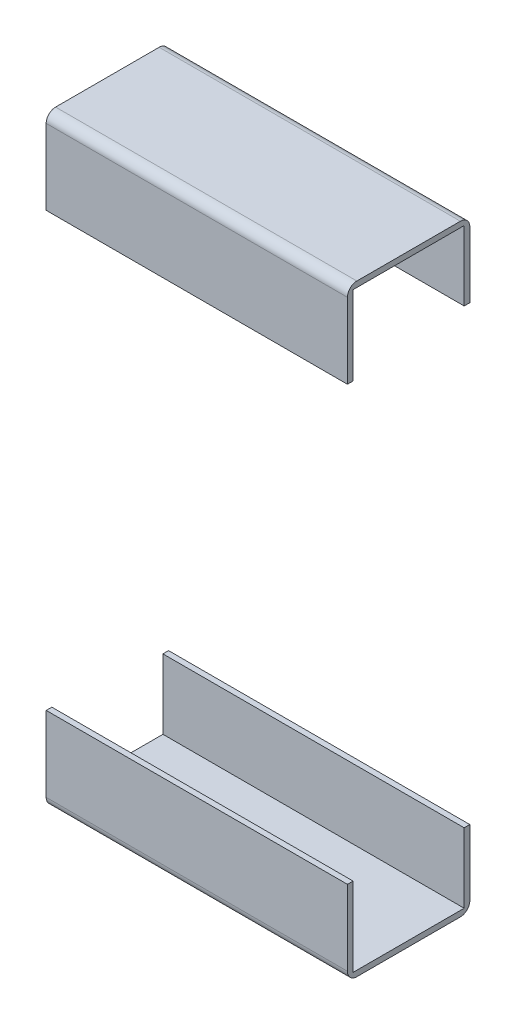
ISO-10303-21;
HEADER;
FILE_DESCRIPTION(('STEP AP214'),'2;1');
FILE_NAME('part.step','',(''),(''),'','','');
FILE_SCHEMA(('AUTOMOTIVE_DESIGN { 1 0 10303 214 1 1 1 1 }'));
ENDSEC;
DATA;
#1=APPLICATION_CONTEXT('core data for automotive mechanical design processes');
#2=APPLICATION_PROTOCOL_DEFINITION('international standard','automotive_design',2000,#1);
#3=PRODUCT_CONTEXT('',#1,'mechanical');
#4=PRODUCT('Part','Part','',(#3));
#5=PRODUCT_RELATED_PRODUCT_CATEGORY('part','',(#4));
#6=PRODUCT_DEFINITION_FORMATION('','',#4);
#7=PRODUCT_DEFINITION_CONTEXT('part definition',#1,'design');
#8=PRODUCT_DEFINITION('design','',#6,#7);
#9=PRODUCT_DEFINITION_SHAPE('','',#8);
#10=(LENGTH_UNIT() NAMED_UNIT(*) SI_UNIT(.MILLI.,.METRE.));
#11=(NAMED_UNIT(*) PLANE_ANGLE_UNIT() SI_UNIT($,.RADIAN.));
#12=(NAMED_UNIT(*) SI_UNIT($,.STERADIAN.) SOLID_ANGLE_UNIT());
#13=UNCERTAINTY_MEASURE_WITH_UNIT(LENGTH_MEASURE(1.E-05),#10,'distance_accuracy_value','');
#14=(GEOMETRIC_REPRESENTATION_CONTEXT(3) GLOBAL_UNCERTAINTY_ASSIGNED_CONTEXT((#13)) GLOBAL_UNIT_ASSIGNED_CONTEXT((#10,
#11,#12)) REPRESENTATION_CONTEXT('',''));
#15=CARTESIAN_POINT('',(0.,0.,0.));
#16=DIRECTION('',(0.,0.,1.));
#17=DIRECTION('',(1.,0.,0.));
#18=AXIS2_PLACEMENT_3D('',#15,#16,#17);
#19=CARTESIAN_POINT('',(0.8,1.375,0.325));
#20=DIRECTION('',(1.,0.,0.));
#21=DIRECTION('',(0.,1.,0.));
#22=AXIS2_PLACEMENT_3D('',#19,#20,#21);
#23=PLANE('',#22);
#24=CARTESIAN_POINT('',(0.8,1.55,0.05));
#25=DIRECTION('',(-1.,0.,0.));
#26=DIRECTION('',(0.,0.707106781186548,-0.707106781186548));
#27=AXIS2_PLACEMENT_3D('',#24,#25,#26);
#28=CIRCLE('',#27,0.05);
#29=CARTESIAN_POINT('',(0.8,1.6,0.05));
#30=VERTEX_POINT('',#29);
#31=CARTESIAN_POINT('',(0.8,1.55,0.));
#32=VERTEX_POINT('',#31);
#33=EDGE_CURVE('P0_E124',#30,#32,#28,.T.);
#34=ORIENTED_EDGE('',*,*,#33,.F.);
#35=DIRECTION('',(0.,0.,1.));
#36=VECTOR('',#35,1.);
#37=CARTESIAN_POINT('',(0.8,1.6,0.));
#38=LINE('',#37,#36);
#39=CARTESIAN_POINT('',(0.8,1.6,0.6));
#40=VERTEX_POINT('',#39);
#41=EDGE_CURVE('P0_E185',#30,#40,#38,.T.);
#42=ORIENTED_EDGE('',*,*,#41,.T.);
#43=CARTESIAN_POINT('',(0.8,1.55,0.6));
#44=DIRECTION('',(-1.,0.,0.));
#45=DIRECTION('',(0.,0.707106781186548,0.707106781186548));
#46=AXIS2_PLACEMENT_3D('',#43,#44,#45);
#47=CIRCLE('',#46,0.05);
#48=CARTESIAN_POINT('',(0.8,1.55,0.65));
#49=VERTEX_POINT('',#48);
#50=EDGE_CURVE('P0_E167',#49,#40,#47,.T.);
#51=ORIENTED_EDGE('',*,*,#50,.F.);
#52=DIRECTION('',(0.,-1.,0.));
#53=VECTOR('',#52,1.);
#54=CARTESIAN_POINT('',(0.8,1.6,0.65));
#55=LINE('',#54,#53);
#56=CARTESIAN_POINT('',(0.8,1.15,0.65));
#57=VERTEX_POINT('',#56);
#58=EDGE_CURVE('P0_E132',#49,#57,#55,.T.);
#59=ORIENTED_EDGE('',*,*,#58,.T.);
#60=DIRECTION('',(0.,0.,-1.));
#61=VECTOR('',#60,1.);
#62=CARTESIAN_POINT('',(0.8,1.15,0.65));
#63=LINE('',#62,#61);
#64=CARTESIAN_POINT('',(0.8,1.15,0.62));
#65=VERTEX_POINT('',#64);
#66=EDGE_CURVE('P0_E11',#57,#65,#63,.T.);
#67=ORIENTED_EDGE('',*,*,#66,.T.);
#68=DIRECTION('',(0.,1.,6.3751913796E-11));
#69=VECTOR('',#68,1.);
#70=CARTESIAN_POINT('',(0.8,1.15,0.62));
#71=LINE('',#70,#69);
#72=CARTESIAN_POINT('',(0.8,1.570000000033,0.620000000027));
#73=VERTEX_POINT('',#72);
#74=EDGE_CURVE('P0_E161',#65,#73,#71,.T.);
#75=ORIENTED_EDGE('',*,*,#74,.T.);
#76=DIRECTION('',(0.,0.,-1.));
#77=VECTOR('',#76,1.);
#78=CARTESIAN_POINT('',(0.8,1.570000000033,0.620000000027));
#79=LINE('',#78,#77);
#80=CARTESIAN_POINT('',(0.8,1.570000000033,0.02999999998487));
#81=VERTEX_POINT('',#80);
#82=EDGE_CURVE('P0_E201',#73,#81,#79,.T.);
#83=ORIENTED_EDGE('',*,*,#82,.T.);
#84=DIRECTION('',(0.,-1.,4.090209542698E-11));
#85=VECTOR('',#84,1.);
#86=CARTESIAN_POINT('',(0.8,1.570000000033,0.02999999998487));
#87=LINE('',#86,#85);
#88=CARTESIAN_POINT('',(0.8,1.2,0.03));
#89=VERTEX_POINT('',#88);
#90=EDGE_CURVE('P0_E193',#81,#89,#87,.T.);
#91=ORIENTED_EDGE('',*,*,#90,.T.);
#92=DIRECTION('',(0.,0.,-1.));
#93=VECTOR('',#92,1.);
#94=CARTESIAN_POINT('',(0.8,1.2,0.03));
#95=LINE('',#94,#93);
#96=CARTESIAN_POINT('',(0.8,1.2,0.));
#97=VERTEX_POINT('',#96);
#98=EDGE_CURVE('P0_E127',#89,#97,#95,.T.);
#99=ORIENTED_EDGE('',*,*,#98,.T.);
#100=DIRECTION('',(0.,1.,0.));
#101=VECTOR('',#100,1.);
#102=CARTESIAN_POINT('',(0.8,1.2,0.));
#103=LINE('',#102,#101);
#104=EDGE_CURVE('P0_E120',#97,#32,#103,.T.);
#105=ORIENTED_EDGE('',*,*,#104,.T.);
#106=EDGE_LOOP('',(#34,#42,#51,#59,#67,#75,#83,#91,#99,#105));
#107=FACE_BOUND('',#106,.T.);
#108=ADVANCED_FACE('P0_F16',(#107),#23,.T.);
#109=CARTESIAN_POINT('',(0.,1.15,0.65));
#110=DIRECTION('',(0.,-1.,0.));
#111=DIRECTION('',(0.,0.,-1.));
#112=AXIS2_PLACEMENT_3D('',#109,#110,#111);
#113=PLANE('',#112);
#114=DIRECTION('',(1.,0.,0.));
#115=VECTOR('',#114,1.);
#116=CARTESIAN_POINT('',(0.,1.15,0.62));
#117=LINE('',#116,#115);
#118=CARTESIAN_POINT('',(-0.8,1.15,0.62));
#119=VERTEX_POINT('',#118);
#120=EDGE_CURVE('P0_E27',#119,#65,#117,.T.);
#121=ORIENTED_EDGE('',*,*,#120,.T.);
#122=ORIENTED_EDGE('',*,*,#66,.F.);
#123=DIRECTION('',(1.,0.,0.));
#124=VECTOR('',#123,1.);
#125=CARTESIAN_POINT('',(0.,1.15,0.65));
#126=LINE('',#125,#124);
#127=CARTESIAN_POINT('',(-0.8,1.15,0.65));
#128=VERTEX_POINT('',#127);
#129=EDGE_CURVE('P0_E166',#128,#57,#126,.T.);
#130=ORIENTED_EDGE('',*,*,#129,.F.);
#131=DIRECTION('',(0.,0.,1.));
#132=VECTOR('',#131,1.);
#133=CARTESIAN_POINT('',(-0.8,1.15,0.65));
#134=LINE('',#133,#132);
#135=EDGE_CURVE('P0_E168',#119,#128,#134,.T.);
#136=ORIENTED_EDGE('',*,*,#135,.F.);
#137=EDGE_LOOP('',(#121,#122,#130,#136));
#138=FACE_BOUND('',#137,.T.);
#139=ADVANCED_FACE('P0_F243',(#138),#113,.T.);
#140=CARTESIAN_POINT('',(0.,1.15,0.62));
#141=DIRECTION('',(0.,6.3751913796E-11,-1.));
#142=DIRECTION('',(-1.,0.,0.));
#143=AXIS2_PLACEMENT_3D('',#140,#141,#142);
#144=PLANE('',#143);
#145=DIRECTION('',(1.,0.,0.));
#146=VECTOR('',#145,1.);
#147=CARTESIAN_POINT('',(0.,1.570000000033,0.620000000027));
#148=LINE('',#147,#146);
#149=CARTESIAN_POINT('',(-0.8,1.570000000033,0.620000000027));
#150=VERTEX_POINT('',#149);
#151=EDGE_CURVE('P0_E20',#150,#73,#148,.T.);
#152=ORIENTED_EDGE('',*,*,#151,.T.);
#153=ORIENTED_EDGE('',*,*,#74,.F.);
#154=ORIENTED_EDGE('',*,*,#120,.F.);
#155=DIRECTION('',(0.,-1.,-6.3751913796E-11));
#156=VECTOR('',#155,1.);
#157=CARTESIAN_POINT('',(-0.8,1.15,0.62));
#158=LINE('',#157,#156);
#159=EDGE_CURVE('P0_E158',#150,#119,#158,.T.);
#160=ORIENTED_EDGE('',*,*,#159,.F.);
#161=EDGE_LOOP('',(#152,#153,#154,#160));
#162=FACE_BOUND('',#161,.T.);
#163=ADVANCED_FACE('P0_F249',(#162),#144,.T.);
#164=CARTESIAN_POINT('',(0.,1.570000000033,0.620000000027));
#165=DIRECTION('',(0.,-1.,0.));
#166=DIRECTION('',(0.,0.,-1.));
#167=AXIS2_PLACEMENT_3D('',#164,#165,#166);
#168=PLANE('',#167);
#169=DIRECTION('',(1.,0.,0.));
#170=VECTOR('',#169,1.);
#171=CARTESIAN_POINT('',(0.,1.570000000033,0.02999999998487));
#172=LINE('',#171,#170);
#173=CARTESIAN_POINT('',(-0.8,1.570000000033,0.02999999998487));
#174=VERTEX_POINT('',#173);
#175=EDGE_CURVE('P0_E195',#174,#81,#172,.T.);
#176=ORIENTED_EDGE('',*,*,#175,.T.);
#177=ORIENTED_EDGE('',*,*,#82,.F.);
#178=ORIENTED_EDGE('',*,*,#151,.F.);
#179=DIRECTION('',(0.,0.,1.));
#180=VECTOR('',#179,1.);
#181=CARTESIAN_POINT('',(-0.8,1.570000000033,0.620000000027));
#182=LINE('',#181,#180);
#183=EDGE_CURVE('P0_E180',#174,#150,#182,.T.);
#184=ORIENTED_EDGE('',*,*,#183,.F.);
#185=EDGE_LOOP('',(#176,#177,#178,#184));
#186=FACE_BOUND('',#185,.T.);
#187=ADVANCED_FACE('P0_F254',(#186),#168,.T.);
#188=CARTESIAN_POINT('',(0.,1.570000000033,0.02999999998487));
#189=DIRECTION('',(0.,4.090209542698E-11,1.));
#190=DIRECTION('',(0.,-1.,4.090209542698E-11));
#191=AXIS2_PLACEMENT_3D('',#188,#189,#190);
#192=PLANE('',#191);
#193=DIRECTION('',(1.,0.,0.));
#194=VECTOR('',#193,1.);
#195=CARTESIAN_POINT('',(0.,1.2,0.03));
#196=LINE('',#195,#194);
#197=CARTESIAN_POINT('',(-0.8,1.2,0.03));
#198=VERTEX_POINT('',#197);
#199=EDGE_CURVE('P0_E196',#198,#89,#196,.T.);
#200=ORIENTED_EDGE('',*,*,#199,.T.);
#201=ORIENTED_EDGE('',*,*,#90,.F.);
#202=ORIENTED_EDGE('',*,*,#175,.F.);
#203=DIRECTION('',(0.,1.,-4.090209542698E-11));
#204=VECTOR('',#203,1.);
#205=CARTESIAN_POINT('',(-0.8,1.570000000033,0.02999999998487));
#206=LINE('',#205,#204);
#207=EDGE_CURVE('P0_E178',#198,#174,#206,.T.);
#208=ORIENTED_EDGE('',*,*,#207,.F.);
#209=EDGE_LOOP('',(#200,#201,#202,#208));
#210=FACE_BOUND('',#209,.T.);
#211=ADVANCED_FACE('P0_F18',(#210),#192,.T.);
#212=CARTESIAN_POINT('',(0.,1.2,0.03));
#213=DIRECTION('',(0.,-1.,0.));
#214=DIRECTION('',(0.,0.,-1.));
#215=AXIS2_PLACEMENT_3D('',#212,#213,#214);
#216=PLANE('',#215);
#217=DIRECTION('',(1.,0.,0.));
#218=VECTOR('',#217,1.);
#219=CARTESIAN_POINT('',(0.,1.2,0.));
#220=LINE('',#219,#218);
#221=CARTESIAN_POINT('',(-0.8,1.2,0.));
#222=VERTEX_POINT('',#221);
#223=EDGE_CURVE('P0_E131',#222,#97,#220,.T.);
#224=ORIENTED_EDGE('',*,*,#223,.T.);
#225=ORIENTED_EDGE('',*,*,#98,.F.);
#226=ORIENTED_EDGE('',*,*,#199,.F.);
#227=DIRECTION('',(0.,0.,1.));
#228=VECTOR('',#227,1.);
#229=CARTESIAN_POINT('',(-0.8,1.2,0.03));
#230=LINE('',#229,#228);
#231=EDGE_CURVE('P0_E175',#222,#198,#230,.T.);
#232=ORIENTED_EDGE('',*,*,#231,.F.);
#233=EDGE_LOOP('',(#224,#225,#226,#232));
#234=FACE_BOUND('',#233,.T.);
#235=ADVANCED_FACE('P0_F259',(#234),#216,.T.);
#236=CARTESIAN_POINT('',(0.,1.2,0.));
#237=DIRECTION('',(0.,0.,-1.));
#238=DIRECTION('',(0.,-1.,0.));
#239=AXIS2_PLACEMENT_3D('',#236,#237,#238);
#240=PLANE('',#239);
#241=DIRECTION('',(-1.,0.,0.));
#242=VECTOR('',#241,1.);
#243=CARTESIAN_POINT('',(0.,1.55,0.));
#244=LINE('',#243,#242);
#245=CARTESIAN_POINT('',(-0.8,1.55,0.));
#246=VERTEX_POINT('',#245);
#247=EDGE_CURVE('P0_E135',#32,#246,#244,.T.);
#248=ORIENTED_EDGE('',*,*,#247,.F.);
#249=ORIENTED_EDGE('',*,*,#104,.F.);
#250=ORIENTED_EDGE('',*,*,#223,.F.);
#251=DIRECTION('',(0.,-1.,0.));
#252=VECTOR('',#251,1.);
#253=CARTESIAN_POINT('',(-0.8,1.2,0.));
#254=LINE('',#253,#252);
#255=EDGE_CURVE('P0_E138',#246,#222,#254,.T.);
#256=ORIENTED_EDGE('',*,*,#255,.F.);
#257=EDGE_LOOP('',(#248,#249,#250,#256));
#258=FACE_BOUND('',#257,.T.);
#259=ADVANCED_FACE('P0_F136',(#258),#240,.T.);
#260=CARTESIAN_POINT('',(0.,1.6,0.65));
#261=DIRECTION('',(0.,0.,1.));
#262=DIRECTION('',(1.,0.,0.));
#263=AXIS2_PLACEMENT_3D('',#260,#261,#262);
#264=PLANE('',#263);
#265=DIRECTION('',(1.,0.,0.));
#266=VECTOR('',#265,1.);
#267=CARTESIAN_POINT('',(0.,1.55,0.65));
#268=LINE('',#267,#266);
#269=CARTESIAN_POINT('',(-0.8,1.55,0.65));
#270=VERTEX_POINT('',#269);
#271=EDGE_CURVE('P0_E162',#270,#49,#268,.T.);
#272=ORIENTED_EDGE('',*,*,#271,.F.);
#273=DIRECTION('',(0.,1.,0.));
#274=VECTOR('',#273,1.);
#275=CARTESIAN_POINT('',(-0.8,1.6,0.65));
#276=LINE('',#275,#274);
#277=EDGE_CURVE('P0_E172',#128,#270,#276,.T.);
#278=ORIENTED_EDGE('',*,*,#277,.F.);
#279=ORIENTED_EDGE('',*,*,#129,.T.);
#280=ORIENTED_EDGE('',*,*,#58,.F.);
#281=EDGE_LOOP('',(#272,#278,#279,#280));
#282=FACE_BOUND('',#281,.T.);
#283=ADVANCED_FACE('P0_F240',(#282),#264,.T.);
#284=CARTESIAN_POINT('',(0.,1.55,0.6));
#285=DIRECTION('',(1.,0.,0.));
#286=DIRECTION('',(0.,0.707106781186548,0.707106781186548));
#287=AXIS2_PLACEMENT_3D('',#284,#285,#286);
#288=CYLINDRICAL_SURFACE('',#287,0.05);
#289=ORIENTED_EDGE('',*,*,#50,.T.);
#290=DIRECTION('',(-1.,0.,0.));
#291=VECTOR('',#290,1.);
#292=CARTESIAN_POINT('',(0.,1.6,0.6));
#293=LINE('',#292,#291);
#294=CARTESIAN_POINT('',(-0.8,1.6,0.6));
#295=VERTEX_POINT('',#294);
#296=EDGE_CURVE('P0_E212',#40,#295,#293,.T.);
#297=ORIENTED_EDGE('',*,*,#296,.T.);
#298=CARTESIAN_POINT('',(-0.8,1.55,0.6));
#299=DIRECTION('',(1.,0.,0.));
#300=DIRECTION('',(0.,0.707106781186548,0.707106781186548));
#301=AXIS2_PLACEMENT_3D('',#298,#299,#300);
#302=CIRCLE('',#301,0.05);
#303=EDGE_CURVE('P0_E113',#295,#270,#302,.T.);
#304=ORIENTED_EDGE('',*,*,#303,.T.);
#305=ORIENTED_EDGE('',*,*,#271,.T.);
#306=EDGE_LOOP('',(#289,#297,#304,#305));
#307=FACE_BOUND('',#306,.T.);
#308=ADVANCED_FACE('P0_F223',(#307),#288,.T.);
#309=CARTESIAN_POINT('',(-0.8,1.375,0.325));
#310=DIRECTION('',(-1.,0.,0.));
#311=DIRECTION('',(0.,0.,1.));
#312=AXIS2_PLACEMENT_3D('',#309,#310,#311);
#313=PLANE('',#312);
#314=CARTESIAN_POINT('',(-0.8,1.55,0.05));
#315=DIRECTION('',(1.,0.,0.));
#316=DIRECTION('',(0.,0.707106781186548,-0.707106781186548));
#317=AXIS2_PLACEMENT_3D('',#314,#315,#316);
#318=CIRCLE('',#317,0.05);
#319=CARTESIAN_POINT('',(-0.8,1.6,0.05));
#320=VERTEX_POINT('',#319);
#321=EDGE_CURVE('P0_E154',#246,#320,#318,.T.);
#322=ORIENTED_EDGE('',*,*,#321,.F.);
#323=ORIENTED_EDGE('',*,*,#255,.T.);
#324=ORIENTED_EDGE('',*,*,#231,.T.);
#325=ORIENTED_EDGE('',*,*,#207,.T.);
#326=ORIENTED_EDGE('',*,*,#183,.T.);
#327=ORIENTED_EDGE('',*,*,#159,.T.);
#328=ORIENTED_EDGE('',*,*,#135,.T.);
#329=ORIENTED_EDGE('',*,*,#277,.T.);
#330=ORIENTED_EDGE('',*,*,#303,.F.);
#331=DIRECTION('',(0.,0.,-1.));
#332=VECTOR('',#331,1.);
#333=CARTESIAN_POINT('',(-0.8,1.6,0.));
#334=LINE('',#333,#332);
#335=EDGE_CURVE('P0_E143',#295,#320,#334,.T.);
#336=ORIENTED_EDGE('',*,*,#335,.T.);
#337=EDGE_LOOP('',(#322,#323,#324,#325,#326,#327,#328,#329,#330,#336));
#338=FACE_BOUND('',#337,.T.);
#339=ADVANCED_FACE('P0_F385',(#338),#313,.T.);
#340=CARTESIAN_POINT('',(0.,1.6,0.));
#341=DIRECTION('',(0.,1.,0.));
#342=DIRECTION('',(1.,0.,0.));
#343=AXIS2_PLACEMENT_3D('',#340,#341,#342);
#344=PLANE('',#343);
#345=DIRECTION('',(1.,0.,0.));
#346=VECTOR('',#345,1.);
#347=CARTESIAN_POINT('',(0.,1.6,0.05));
#348=LINE('',#347,#346);
#349=EDGE_CURVE('P0_E147',#320,#30,#348,.T.);
#350=ORIENTED_EDGE('',*,*,#349,.F.);
#351=ORIENTED_EDGE('',*,*,#335,.F.);
#352=ORIENTED_EDGE('',*,*,#296,.F.);
#353=ORIENTED_EDGE('',*,*,#41,.F.);
#354=EDGE_LOOP('',(#350,#351,#352,#353));
#355=FACE_BOUND('',#354,.T.);
#356=ADVANCED_FACE('P0_F221',(#355),#344,.T.);
#357=CARTESIAN_POINT('',(0.,1.55,0.05));
#358=DIRECTION('',(-1.,0.,0.));
#359=DIRECTION('',(0.,0.707106781186548,-0.707106781186548));
#360=AXIS2_PLACEMENT_3D('',#357,#358,#359);
#361=CYLINDRICAL_SURFACE('',#360,0.05);
#362=ORIENTED_EDGE('',*,*,#321,.T.);
#363=ORIENTED_EDGE('',*,*,#349,.T.);
#364=ORIENTED_EDGE('',*,*,#33,.T.);
#365=ORIENTED_EDGE('',*,*,#247,.T.);
#366=EDGE_LOOP('',(#362,#363,#364,#365));
#367=FACE_BOUND('',#366,.T.);
#368=ADVANCED_FACE('P0_F145',(#367),#361,.T.);
#369=CLOSED_SHELL('',(#108,#139,#163,#187,#211,#235,#259,#283,#308,#339,#356,#368));
#370=MANIFOLD_SOLID_BREP('P0_B1',#369);
#371=CARTESIAN_POINT('',(0.8,-1.375,0.325));
#372=DIRECTION('',(1.,0.,0.));
#373=DIRECTION('',(0.,1.,0.));
#374=AXIS2_PLACEMENT_3D('',#371,#372,#373);
#375=PLANE('',#374);
#376=CARTESIAN_POINT('',(0.8,-1.55,0.05));
#377=DIRECTION('',(-1.,0.,0.));
#378=DIRECTION('',(0.,-0.707106781186548,-0.707106781186548));
#379=AXIS2_PLACEMENT_3D('',#376,#377,#378);
#380=CIRCLE('',#379,0.05);
#381=CARTESIAN_POINT('',(0.8,-1.55,0.));
#382=VERTEX_POINT('',#381);
#383=CARTESIAN_POINT('',(0.8,-1.6,0.05));
#384=VERTEX_POINT('',#383);
#385=EDGE_CURVE('P1_E184',#382,#384,#380,.T.);
#386=ORIENTED_EDGE('',*,*,#385,.F.);
#387=DIRECTION('',(0.,1.,0.));
#388=VECTOR('',#387,1.);
#389=CARTESIAN_POINT('',(0.8,-1.6,0.));
#390=LINE('',#389,#388);
#391=CARTESIAN_POINT('',(0.8,-1.2,0.));
#392=VERTEX_POINT('',#391);
#393=EDGE_CURVE('P1_E136',#382,#392,#390,.T.);
#394=ORIENTED_EDGE('',*,*,#393,.T.);
#395=DIRECTION('',(0.,0.,1.));
#396=VECTOR('',#395,1.);
#397=CARTESIAN_POINT('',(0.8,-1.2,0.));
#398=LINE('',#397,#396);
#399=CARTESIAN_POINT('',(0.8,-1.2,0.03));
#400=VERTEX_POINT('',#399);
#401=EDGE_CURVE('P1_E192',#392,#400,#398,.T.);
#402=ORIENTED_EDGE('',*,*,#401,.T.);
#403=DIRECTION('',(0.,-1.,-4.090209542698E-11));
#404=VECTOR('',#403,1.);
#405=CARTESIAN_POINT('',(0.8,-1.2,0.03));
#406=LINE('',#405,#404);
#407=CARTESIAN_POINT('',(0.8,-1.570000000033,0.02999999998487));
#408=VERTEX_POINT('',#407);
#409=EDGE_CURVE('P1_E11',#400,#408,#406,.T.);
#410=ORIENTED_EDGE('',*,*,#409,.T.);
#411=DIRECTION('',(0.,0.,1.));
#412=VECTOR('',#411,1.);
#413=CARTESIAN_POINT('',(0.8,-1.570000000033,0.02999999998487));
#414=LINE('',#413,#412);
#415=CARTESIAN_POINT('',(0.8,-1.570000000033,0.620000000027));
#416=VERTEX_POINT('',#415);
#417=EDGE_CURVE('P1_E177',#408,#416,#414,.T.);
#418=ORIENTED_EDGE('',*,*,#417,.T.);
#419=DIRECTION('',(0.,1.,-6.3751913796E-11));
#420=VECTOR('',#419,1.);
#421=CARTESIAN_POINT('',(0.8,-1.570000000033,0.620000000027));
#422=LINE('',#421,#420);
#423=CARTESIAN_POINT('',(0.8,-1.15,0.62));
#424=VERTEX_POINT('',#423);
#425=EDGE_CURVE('P1_E186',#416,#424,#422,.T.);
#426=ORIENTED_EDGE('',*,*,#425,.T.);
#427=DIRECTION('',(0.,0.,1.));
#428=VECTOR('',#427,1.);
#429=CARTESIAN_POINT('',(0.8,-1.15,0.62));
#430=LINE('',#429,#428);
#431=CARTESIAN_POINT('',(0.8,-1.15,0.65));
#432=VERTEX_POINT('',#431);
#433=EDGE_CURVE('P1_E131',#424,#432,#430,.T.);
#434=ORIENTED_EDGE('',*,*,#433,.T.);
#435=DIRECTION('',(0.,-1.,0.));
#436=VECTOR('',#435,1.);
#437=CARTESIAN_POINT('',(0.8,-1.15,0.65));
#438=LINE('',#437,#436);
#439=CARTESIAN_POINT('',(0.8,-1.55,0.65));
#440=VERTEX_POINT('',#439);
#441=EDGE_CURVE('P1_E142',#432,#440,#438,.T.);
#442=ORIENTED_EDGE('',*,*,#441,.T.);
#443=CARTESIAN_POINT('',(0.8,-1.55,0.6));
#444=DIRECTION('',(-1.,0.,0.));
#445=DIRECTION('',(0.,-0.707106781186548,0.707106781186548));
#446=AXIS2_PLACEMENT_3D('',#443,#444,#445);
#447=CIRCLE('',#446,0.05);
#448=CARTESIAN_POINT('',(0.8,-1.6,0.6));
#449=VERTEX_POINT('',#448);
#450=EDGE_CURVE('P1_E145',#449,#440,#447,.T.);
#451=ORIENTED_EDGE('',*,*,#450,.F.);
#452=DIRECTION('',(0.,0.,-1.));
#453=VECTOR('',#452,1.);
#454=CARTESIAN_POINT('',(0.8,-1.6,0.65));
#455=LINE('',#454,#453);
#456=EDGE_CURVE('P1_E98',#449,#384,#455,.T.);
#457=ORIENTED_EDGE('',*,*,#456,.T.);
#458=EDGE_LOOP('',(#386,#394,#402,#410,#418,#426,#434,#442,#451,#457));
#459=FACE_BOUND('',#458,.T.);
#460=ADVANCED_FACE('P1_F16',(#459),#375,.T.);
#461=CARTESIAN_POINT('',(0.,-1.2,0.03));
#462=DIRECTION('',(0.,-4.090209542698E-11,1.));
#463=DIRECTION('',(0.,-1.,-4.090209542698E-11));
#464=AXIS2_PLACEMENT_3D('',#461,#462,#463);
#465=PLANE('',#464);
#466=DIRECTION('',(1.,0.,0.));
#467=VECTOR('',#466,1.);
#468=CARTESIAN_POINT('',(0.,-1.570000000033,0.02999999998487));
#469=LINE('',#468,#467);
#470=CARTESIAN_POINT('',(-0.8,-1.570000000033,0.02999999998487));
#471=VERTEX_POINT('',#470);
#472=EDGE_CURVE('P1_E27',#471,#408,#469,.T.);
#473=ORIENTED_EDGE('',*,*,#472,.T.);
#474=ORIENTED_EDGE('',*,*,#409,.F.);
#475=DIRECTION('',(-1.,0.,0.));
#476=VECTOR('',#475,1.);
#477=CARTESIAN_POINT('',(0.,-1.2,0.03));
#478=LINE('',#477,#476);
#479=CARTESIAN_POINT('',(-0.8,-1.2,0.03));
#480=VERTEX_POINT('',#479);
#481=EDGE_CURVE('P1_E160',#400,#480,#478,.T.);
#482=ORIENTED_EDGE('',*,*,#481,.T.);
#483=DIRECTION('',(0.,1.,4.090209542698E-11));
#484=VECTOR('',#483,1.);
#485=CARTESIAN_POINT('',(-0.8,-1.2,0.03));
#486=LINE('',#485,#484);
#487=EDGE_CURVE('P1_E224',#471,#480,#486,.T.);
#488=ORIENTED_EDGE('',*,*,#487,.F.);
#489=EDGE_LOOP('',(#473,#474,#482,#488));
#490=FACE_BOUND('',#489,.T.);
#491=ADVANCED_FACE('P1_F18',(#490),#465,.T.);
#492=CARTESIAN_POINT('',(0.,-1.570000000033,0.02999999998487));
#493=DIRECTION('',(0.,1.,0.));
#494=DIRECTION('',(1.,0.,0.));
#495=AXIS2_PLACEMENT_3D('',#492,#493,#494);
#496=PLANE('',#495);
#497=DIRECTION('',(1.,0.,0.));
#498=VECTOR('',#497,1.);
#499=CARTESIAN_POINT('',(0.,-1.570000000033,0.620000000027));
#500=LINE('',#499,#498);
#501=CARTESIAN_POINT('',(-0.8,-1.570000000033,0.620000000027));
#502=VERTEX_POINT('',#501);
#503=EDGE_CURVE('P1_E124',#502,#416,#500,.T.);
#504=ORIENTED_EDGE('',*,*,#503,.T.);
#505=ORIENTED_EDGE('',*,*,#417,.F.);
#506=ORIENTED_EDGE('',*,*,#472,.F.);
#507=DIRECTION('',(0.,0.,-1.));
#508=VECTOR('',#507,1.);
#509=CARTESIAN_POINT('',(-0.8,-1.570000000033,0.02999999998487));
#510=LINE('',#509,#508);
#511=EDGE_CURVE('P1_E220',#502,#471,#510,.T.);
#512=ORIENTED_EDGE('',*,*,#511,.F.);
#513=EDGE_LOOP('',(#504,#505,#506,#512));
#514=FACE_BOUND('',#513,.T.);
#515=ADVANCED_FACE('P1_F316',(#514),#496,.T.);
#516=CARTESIAN_POINT('',(0.,-1.570000000033,0.620000000027));
#517=DIRECTION('',(0.,-6.3751913796E-11,-1.));
#518=DIRECTION('',(0.,-1.,6.3751913796E-11));
#519=AXIS2_PLACEMENT_3D('',#516,#517,#518);
#520=PLANE('',#519);
#521=DIRECTION('',(1.,0.,0.));
#522=VECTOR('',#521,1.);
#523=CARTESIAN_POINT('',(0.,-1.15,0.62));
#524=LINE('',#523,#522);
#525=CARTESIAN_POINT('',(-0.8,-1.15,0.62));
#526=VERTEX_POINT('',#525);
#527=EDGE_CURVE('P1_E176',#526,#424,#524,.T.);
#528=ORIENTED_EDGE('',*,*,#527,.T.);
#529=ORIENTED_EDGE('',*,*,#425,.F.);
#530=ORIENTED_EDGE('',*,*,#503,.F.);
#531=DIRECTION('',(0.,-1.,6.3751913796E-11));
#532=VECTOR('',#531,1.);
#533=CARTESIAN_POINT('',(-0.8,-1.570000000033,0.620000000027));
#534=LINE('',#533,#532);
#535=EDGE_CURVE('P1_E225',#526,#502,#534,.T.);
#536=ORIENTED_EDGE('',*,*,#535,.F.);
#537=EDGE_LOOP('',(#528,#529,#530,#536));
#538=FACE_BOUND('',#537,.T.);
#539=ADVANCED_FACE('P1_F235',(#538),#520,.T.);
#540=CARTESIAN_POINT('',(0.,-1.15,0.62));
#541=DIRECTION('',(0.,1.,0.));
#542=DIRECTION('',(1.,0.,0.));
#543=AXIS2_PLACEMENT_3D('',#540,#541,#542);
#544=PLANE('',#543);
#545=DIRECTION('',(1.,0.,0.));
#546=VECTOR('',#545,1.);
#547=CARTESIAN_POINT('',(0.,-1.15,0.65));
#548=LINE('',#547,#546);
#549=CARTESIAN_POINT('',(-0.8,-1.15,0.65));
#550=VERTEX_POINT('',#549);
#551=EDGE_CURVE('P1_E149',#550,#432,#548,.T.);
#552=ORIENTED_EDGE('',*,*,#551,.T.);
#553=ORIENTED_EDGE('',*,*,#433,.F.);
#554=ORIENTED_EDGE('',*,*,#527,.F.);
#555=DIRECTION('',(0.,0.,-1.));
#556=VECTOR('',#555,1.);
#557=CARTESIAN_POINT('',(-0.8,-1.15,0.62));
#558=LINE('',#557,#556);
#559=EDGE_CURVE('P1_E228',#550,#526,#558,.T.);
#560=ORIENTED_EDGE('',*,*,#559,.F.);
#561=EDGE_LOOP('',(#552,#553,#554,#560));
#562=FACE_BOUND('',#561,.T.);
#563=ADVANCED_FACE('P1_F239',(#562),#544,.T.);
#564=CARTESIAN_POINT('',(0.,-1.15,0.65));
#565=DIRECTION('',(0.,0.,1.));
#566=DIRECTION('',(1.,0.,0.));
#567=AXIS2_PLACEMENT_3D('',#564,#565,#566);
#568=PLANE('',#567);
#569=DIRECTION('',(-1.,0.,0.));
#570=VECTOR('',#569,1.);
#571=CARTESIAN_POINT('',(0.,-1.55,0.65));
#572=LINE('',#571,#570);
#573=CARTESIAN_POINT('',(-0.8,-1.55,0.65));
#574=VERTEX_POINT('',#573);
#575=EDGE_CURVE('P1_E152',#440,#574,#572,.T.);
#576=ORIENTED_EDGE('',*,*,#575,.F.);
#577=ORIENTED_EDGE('',*,*,#441,.F.);
#578=ORIENTED_EDGE('',*,*,#551,.F.);
#579=DIRECTION('',(0.,1.,0.));
#580=VECTOR('',#579,1.);
#581=CARTESIAN_POINT('',(-0.8,-1.15,0.65));
#582=LINE('',#581,#580);
#583=EDGE_CURVE('P1_E155',#574,#550,#582,.T.);
#584=ORIENTED_EDGE('',*,*,#583,.F.);
#585=EDGE_LOOP('',(#576,#577,#578,#584));
#586=FACE_BOUND('',#585,.T.);
#587=ADVANCED_FACE('P1_F153',(#586),#568,.T.);
#588=CARTESIAN_POINT('',(0.,-1.6,0.));
#589=DIRECTION('',(0.,0.,-1.));
#590=DIRECTION('',(-1.,0.,0.));
#591=AXIS2_PLACEMENT_3D('',#588,#589,#590);
#592=PLANE('',#591);
#593=DIRECTION('',(1.,0.,0.));
#594=VECTOR('',#593,1.);
#595=CARTESIAN_POINT('',(0.,-1.55,0.));
#596=LINE('',#595,#594);
#597=CARTESIAN_POINT('',(-0.8,-1.55,0.));
#598=VERTEX_POINT('',#597);
#599=EDGE_CURVE('P1_E209',#598,#382,#596,.T.);
#600=ORIENTED_EDGE('',*,*,#599,.F.);
#601=DIRECTION('',(0.,-1.,0.));
#602=VECTOR('',#601,1.);
#603=CARTESIAN_POINT('',(-0.8,-1.6,0.));
#604=LINE('',#603,#602);
#605=CARTESIAN_POINT('',(-0.8,-1.2,0.));
#606=VERTEX_POINT('',#605);
#607=EDGE_CURVE('P1_E200',#606,#598,#604,.T.);
#608=ORIENTED_EDGE('',*,*,#607,.F.);
#609=DIRECTION('',(1.,0.,0.));
#610=VECTOR('',#609,1.);
#611=CARTESIAN_POINT('',(0.,-1.2,0.));
#612=LINE('',#611,#610);
#613=EDGE_CURVE('P1_E195',#606,#392,#612,.T.);
#614=ORIENTED_EDGE('',*,*,#613,.T.);
#615=ORIENTED_EDGE('',*,*,#393,.F.);
#616=EDGE_LOOP('',(#600,#608,#614,#615));
#617=FACE_BOUND('',#616,.T.);
#618=ADVANCED_FACE('P1_F306',(#617),#592,.T.);
#619=CARTESIAN_POINT('',(0.,-1.2,0.));
#620=DIRECTION('',(0.,1.,0.));
#621=DIRECTION('',(1.,0.,0.));
#622=AXIS2_PLACEMENT_3D('',#619,#620,#621);
#623=PLANE('',#622);
#624=ORIENTED_EDGE('',*,*,#481,.F.);
#625=ORIENTED_EDGE('',*,*,#401,.F.);
#626=ORIENTED_EDGE('',*,*,#613,.F.);
#627=DIRECTION('',(0.,0.,-1.));
#628=VECTOR('',#627,1.);
#629=CARTESIAN_POINT('',(-0.8,-1.2,0.));
#630=LINE('',#629,#628);
#631=EDGE_CURVE('P1_E20',#480,#606,#630,.T.);
#632=ORIENTED_EDGE('',*,*,#631,.F.);
#633=EDGE_LOOP('',(#624,#625,#626,#632));
#634=FACE_BOUND('',#633,.T.);
#635=ADVANCED_FACE('P1_F300',(#634),#623,.T.);
#636=CARTESIAN_POINT('',(0.,-1.55,0.6));
#637=DIRECTION('',(1.,0.,0.));
#638=DIRECTION('',(0.,-0.707106781186548,0.707106781186548));
#639=AXIS2_PLACEMENT_3D('',#636,#637,#638);
#640=CYLINDRICAL_SURFACE('',#639,0.05);
#641=ORIENTED_EDGE('',*,*,#450,.T.);
#642=ORIENTED_EDGE('',*,*,#575,.T.);
#643=CARTESIAN_POINT('',(-0.8,-1.55,0.6));
#644=DIRECTION('',(1.,0.,0.));
#645=DIRECTION('',(0.,-0.707106781186548,0.707106781186548));
#646=AXIS2_PLACEMENT_3D('',#643,#644,#645);
#647=CIRCLE('',#646,0.05);
#648=CARTESIAN_POINT('',(-0.8,-1.6,0.6));
#649=VERTEX_POINT('',#648);
#650=EDGE_CURVE('P1_E189',#574,#649,#647,.T.);
#651=ORIENTED_EDGE('',*,*,#650,.T.);
#652=DIRECTION('',(1.,0.,0.));
#653=VECTOR('',#652,1.);
#654=CARTESIAN_POINT('',(0.,-1.6,0.6));
#655=LINE('',#654,#653);
#656=EDGE_CURVE('P1_E163',#649,#449,#655,.T.);
#657=ORIENTED_EDGE('',*,*,#656,.T.);
#658=EDGE_LOOP('',(#641,#642,#651,#657));
#659=FACE_BOUND('',#658,.T.);
#660=ADVANCED_FACE('P1_F162',(#659),#640,.T.);
#661=CARTESIAN_POINT('',(0.,-1.6,0.65));
#662=DIRECTION('',(0.,-1.,0.));
#663=DIRECTION('',(0.,0.,-1.));
#664=AXIS2_PLACEMENT_3D('',#661,#662,#663);
#665=PLANE('',#664);
#666=DIRECTION('',(-1.,0.,0.));
#667=VECTOR('',#666,1.);
#668=CARTESIAN_POINT('',(0.,-1.6,0.05));
#669=LINE('',#668,#667);
#670=CARTESIAN_POINT('',(-0.8,-1.6,0.05));
#671=VERTEX_POINT('',#670);
#672=EDGE_CURVE('P1_E180',#384,#671,#669,.T.);
#673=ORIENTED_EDGE('',*,*,#672,.F.);
#674=ORIENTED_EDGE('',*,*,#456,.F.);
#675=ORIENTED_EDGE('',*,*,#656,.F.);
#676=DIRECTION('',(0.,0.,1.));
#677=VECTOR('',#676,1.);
#678=CARTESIAN_POINT('',(-0.8,-1.6,0.65));
#679=LINE('',#678,#677);
#680=EDGE_CURVE('P1_E88',#671,#649,#679,.T.);
#681=ORIENTED_EDGE('',*,*,#680,.F.);
#682=EDGE_LOOP('',(#673,#674,#675,#681));
#683=FACE_BOUND('',#682,.T.);
#684=ADVANCED_FACE('P1_F371',(#683),#665,.T.);
#685=CARTESIAN_POINT('',(-0.8,-1.375,0.325));
#686=DIRECTION('',(-1.,0.,0.));
#687=DIRECTION('',(0.,0.,1.));
#688=AXIS2_PLACEMENT_3D('',#685,#686,#687);
#689=PLANE('',#688);
#690=CARTESIAN_POINT('',(-0.8,-1.55,0.05));
#691=DIRECTION('',(1.,0.,0.));
#692=DIRECTION('',(0.,-0.707106781186548,-0.707106781186548));
#693=AXIS2_PLACEMENT_3D('',#690,#691,#692);
#694=CIRCLE('',#693,0.05);
#695=EDGE_CURVE('P1_E183',#671,#598,#694,.T.);
#696=ORIENTED_EDGE('',*,*,#695,.F.);
#697=ORIENTED_EDGE('',*,*,#680,.T.);
#698=ORIENTED_EDGE('',*,*,#650,.F.);
#699=ORIENTED_EDGE('',*,*,#583,.T.);
#700=ORIENTED_EDGE('',*,*,#559,.T.);
#701=ORIENTED_EDGE('',*,*,#535,.T.);
#702=ORIENTED_EDGE('',*,*,#511,.T.);
#703=ORIENTED_EDGE('',*,*,#487,.T.);
#704=ORIENTED_EDGE('',*,*,#631,.T.);
#705=ORIENTED_EDGE('',*,*,#607,.T.);
#706=EDGE_LOOP('',(#696,#697,#698,#699,#700,#701,#702,#703,#704,#705));
#707=FACE_BOUND('',#706,.T.);
#708=ADVANCED_FACE('P1_F360',(#707),#689,.T.);
#709=CARTESIAN_POINT('',(0.,-1.55,0.05));
#710=DIRECTION('',(1.,0.,0.));
#711=DIRECTION('',(0.,-0.707106781186548,-0.707106781186548));
#712=AXIS2_PLACEMENT_3D('',#709,#710,#711);
#713=CYLINDRICAL_SURFACE('',#712,0.05);
#714=ORIENTED_EDGE('',*,*,#385,.T.);
#715=ORIENTED_EDGE('',*,*,#672,.T.);
#716=ORIENTED_EDGE('',*,*,#695,.T.);
#717=ORIENTED_EDGE('',*,*,#599,.T.);
#718=EDGE_LOOP('',(#714,#715,#716,#717));
#719=FACE_BOUND('',#718,.T.);
#720=ADVANCED_FACE('P1_F355',(#719),#713,.T.);
#721=CLOSED_SHELL('',(#460,#491,#515,#539,#563,#587,#618,#635,#660,#684,#708,#720));
#722=MANIFOLD_SOLID_BREP('P1_B1',#721);
#723=ADVANCED_BREP_SHAPE_REPRESENTATION('',(#18,#370,#722),#14);
#724=SHAPE_DEFINITION_REPRESENTATION(#9,#723);
ENDSEC;
END-ISO-10303-21;
